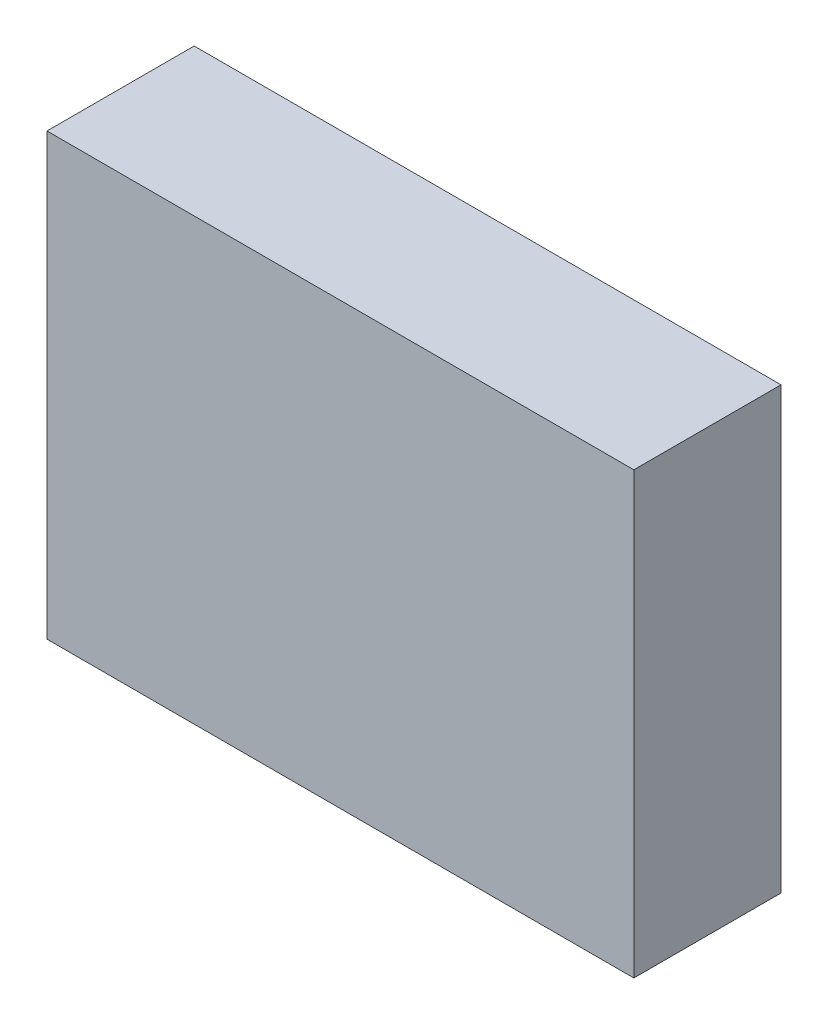
ISO-10303-21;
HEADER;
FILE_DESCRIPTION(('STEP AP214'),'2;1');
FILE_NAME('part.step','',(''),(''),'','','');
FILE_SCHEMA(('AUTOMOTIVE_DESIGN { 1 0 10303 214 1 1 1 1 }'));
ENDSEC;
DATA;
#1=APPLICATION_CONTEXT('core data for automotive mechanical design processes');
#2=APPLICATION_PROTOCOL_DEFINITION('international standard','automotive_design',2000,#1);
#3=PRODUCT_CONTEXT('',#1,'mechanical');
#4=PRODUCT('Part','Part','',(#3));
#5=PRODUCT_RELATED_PRODUCT_CATEGORY('part','',(#4));
#6=PRODUCT_DEFINITION_FORMATION('','',#4);
#7=PRODUCT_DEFINITION_CONTEXT('part definition',#1,'design');
#8=PRODUCT_DEFINITION('design','',#6,#7);
#9=PRODUCT_DEFINITION_SHAPE('','',#8);
#10=(LENGTH_UNIT() NAMED_UNIT(*) SI_UNIT(.MILLI.,.METRE.));
#11=(NAMED_UNIT(*) PLANE_ANGLE_UNIT() SI_UNIT($,.RADIAN.));
#12=(NAMED_UNIT(*) SI_UNIT($,.STERADIAN.) SOLID_ANGLE_UNIT());
#13=UNCERTAINTY_MEASURE_WITH_UNIT(LENGTH_MEASURE(1.E-05),#10,'distance_accuracy_value','');
#14=(GEOMETRIC_REPRESENTATION_CONTEXT(3) GLOBAL_UNCERTAINTY_ASSIGNED_CONTEXT((#13)) GLOBAL_UNIT_ASSIGNED_CONTEXT((#10,
#11,#12)) REPRESENTATION_CONTEXT('',''));
#15=CARTESIAN_POINT('',(0.,0.,0.));
#16=DIRECTION('',(0.,0.,1.));
#17=DIRECTION('',(1.,0.,0.));
#18=AXIS2_PLACEMENT_3D('',#15,#16,#17);
#19=CARTESIAN_POINT('',(59.3051276460055,-52.8416048933411,53.6665382280654));
#20=DIRECTION('',(0.,0.,1.));
#21=DIRECTION('',(1.,0.,0.));
#22=AXIS2_PLACEMENT_3D('',#19,#20,#21);
#23=PLANE('',#22);
#24=DIRECTION('',(-0.469471562785901,0.882947592858921,0.));
#25=VECTOR('',#24,1.);
#26=CARTESIAN_POINT('',(-3.14628098078929,-35.7925910209591,53.6665382280654));
#27=LINE('',#26,#25);
#28=CARTESIAN_POINT('',(-32.7524129730902,19.8884449534964,53.6665382280654));
#29=VERTEX_POINT('',#28);
#30=CARTESIAN_POINT('',(-1.76003319563037,-38.3997439180351,53.6665382280654));
#31=VERTEX_POINT('',#30);
#32=EDGE_CURVE('E441',#29,#31,#27,.F.);
#33=ORIENTED_EDGE('',*,*,#32,.F.);
#34=CARTESIAN_POINT('',(-25.6621679470013,23.6583951066589,53.6665382280654));
#35=DIRECTION('',(0.,0.,1.));
#36=DIRECTION('',(1.,0.,0.));
#37=AXIS2_PLACEMENT_3D('',#34,#35,#36);
#38=CIRCLE('',#37,8.03019916859524);
#39=CARTESIAN_POINT('',(-19.0048311211356,28.148825495194,53.6665382280654));
#40=VERTEX_POINT('',#39);
#41=EDGE_CURVE('E438',#40,#29,#38,.T.);
#42=ORIENTED_EDGE('',*,*,#41,.F.);
#43=DIRECTION('',(0.559192903470745,-0.829037572555043,0.));
#44=VECTOR('',#43,1.);
#45=CARTESIAN_POINT('',(-19.0048311211356,28.148825495194,53.6665382280654));
#46=LINE('',#45,#44);
#47=CARTESIAN_POINT('',(24.76245284847,-36.7388414159568,53.6665382280654));
#48=VERTEX_POINT('',#47);
#49=EDGE_CURVE('E432',#48,#40,#46,.F.);
#50=ORIENTED_EDGE('',*,*,#49,.F.);
#51=DIRECTION('',(0.998044963916957,0.0625000000000001,0.));
#52=VECTOR('',#51,1.);
#53=CARTESIAN_POINT('',(25.849431053587,-36.6707722003644,53.6665382280654));
#54=LINE('',#53,#52);
#55=CARTESIAN_POINT('',(58.1657401979683,-34.6470464219215,53.6665382280654));
#56=VERTEX_POINT('',#55);
#57=EDGE_CURVE('E435',#56,#48,#54,.F.);
#58=ORIENTED_EDGE('',*,*,#57,.F.);
#59=CARTESIAN_POINT('',(59.3051276460055,-52.8416048933411,53.6665382280654));
#60=DIRECTION('',(0.,0.,1.));
#61=DIRECTION('',(1.,0.,0.));
#62=AXIS2_PLACEMENT_3D('',#59,#60,#61);
#63=CIRCLE('',#62,18.2301991685952);
#64=CARTESIAN_POINT('',(58.1657401979683,-71.0361633647607,53.6665382280654));
#65=VERTEX_POINT('',#64);
#66=EDGE_CURVE('E444',#65,#56,#63,.T.);
#67=ORIENTED_EDGE('',*,*,#66,.F.);
#68=DIRECTION('',(-0.998044963916957,0.0625,0.));
#69=VECTOR('',#68,1.);
#70=CARTESIAN_POINT('',(58.1657401979683,-71.0361633647607,53.6665382280654));
#71=LINE('',#70,#69);
#72=CARTESIAN_POINT('',(-23.1155098020317,-65.9461340487842,53.6665382280654));
#73=VERTEX_POINT('',#72);
#74=EDGE_CURVE('E447',#73,#65,#71,.F.);
#75=ORIENTED_EDGE('',*,*,#74,.F.);
#76=CARTESIAN_POINT('',(-22.2948723539945,-52.8416048933411,53.6665382280654));
#77=DIRECTION('',(0.,0.,1.));
#78=DIRECTION('',(1.,0.,0.));
#79=AXIS2_PLACEMENT_3D('',#76,#77,#78);
#80=CIRCLE('',#79,13.1301991685952);
#81=CARTESIAN_POINT('',(-23.1155098020317,-39.737075737898,53.6665382280654));
#82=VERTEX_POINT('',#81);
#83=EDGE_CURVE('E450',#82,#73,#80,.T.);
#84=ORIENTED_EDGE('',*,*,#83,.F.);
#85=DIRECTION('',(0.998044963916957,0.0625000000000001,0.));
#86=VECTOR('',#85,1.);
#87=CARTESIAN_POINT('',(-23.1155098020317,-39.737075737898,53.6665382280654));
#88=LINE('',#87,#86);
#89=EDGE_CURVE('E453',#31,#82,#88,.F.);
#90=ORIENTED_EDGE('',*,*,#89,.F.);
#91=EDGE_LOOP('',(#33,#42,#50,#58,#67,#75,#84,#90));
#92=FACE_BOUND('',#91,.T.);
#93=CARTESIAN_POINT('',(-22.2948723539945,-52.8416048933411,53.6665382280654));
#94=DIRECTION('',(0.,0.,1.));
#95=DIRECTION('',(1.,0.,0.));
#96=AXIS2_PLACEMENT_3D('',#93,#94,#95);
#97=CIRCLE('',#96,5.1);
#98=CARTESIAN_POINT('',(-17.1948723539945,-52.8416048933411,53.6665382280654));
#99=VERTEX_POINT('',#98);
#100=EDGE_CURVE('E361',#99,#99,#97,.T.);
#101=ORIENTED_EDGE('',*,*,#100,.T.);
#102=EDGE_LOOP('',(#101));
#103=FACE_BOUND('',#102,.T.);
#104=CARTESIAN_POINT('',(-27.1285006572868,25.9730850656814,53.6665382280654));
#105=DIRECTION('',(0.,0.,1.));
#106=DIRECTION('',(1.,0.,0.));
#107=AXIS2_PLACEMENT_3D('',#104,#105,#106);
#108=CIRCLE('',#107,4.08000000000002);
#109=CARTESIAN_POINT('',(-23.5951170098463,28.0130850656814,53.6665382280654));
#110=VERTEX_POINT('',#109);
#111=CARTESIAN_POINT('',(-30.6618843047273,23.9330850656813,53.6665382280654));
#112=VERTEX_POINT('',#111);
#113=EDGE_CURVE('E365',#110,#112,#108,.T.);
#114=ORIENTED_EDGE('',*,*,#113,.T.);
#115=DIRECTION('',(0.499999999999998,-0.86602540378444,0.));
#116=VECTOR('',#115,1.);
#117=CARTESIAN_POINT('',(-30.6618843047273,23.9330850656813,53.6665382280654));
#118=LINE('',#117,#116);
#119=CARTESIAN_POINT('',(-10.2618843047272,-11.4007514087238,53.6665382280654));
#120=VERTEX_POINT('',#119);
#121=EDGE_CURVE('E368',#112,#120,#118,.T.);
#122=ORIENTED_EDGE('',*,*,#121,.T.);
#123=CARTESIAN_POINT('',(-6.72850065728666,-9.36075140872365,53.6665382280654));
#124=DIRECTION('',(0.,0.,1.));
#125=DIRECTION('',(1.,0.,0.));
#126=AXIS2_PLACEMENT_3D('',#123,#124,#125);
#127=CIRCLE('',#126,4.08000000000013);
#128=CARTESIAN_POINT('',(-3.19511700984616,-7.32075140872364,53.6665382280654));
#129=VERTEX_POINT('',#128);
#130=EDGE_CURVE('E372',#120,#129,#127,.T.);
#131=ORIENTED_EDGE('',*,*,#130,.T.);
#132=DIRECTION('',(-0.500000000000003,0.866025403784437,0.));
#133=VECTOR('',#132,1.);
#134=CARTESIAN_POINT('',(-23.5951170098463,28.0130850656814,53.6665382280654));
#135=LINE('',#134,#133);
#136=EDGE_CURVE('E376',#129,#110,#135,.T.);
#137=ORIENTED_EDGE('',*,*,#136,.T.);
#138=EDGE_LOOP('',(#114,#122,#131,#137));
#139=FACE_BOUND('',#138,.T.);
#140=DIRECTION('',(-0.866025403784439,-0.5,0.));
#141=VECTOR('',#140,1.);
#142=CARTESIAN_POINT('',(59.3051276460056,-38.7080703035791,53.6665382280654));
#143=LINE('',#142,#141);
#144=CARTESIAN_POINT('',(59.3051276460056,-38.7080703035791,53.6665382280654));
#145=VERTEX_POINT('',#144);
#146=CARTESIAN_POINT('',(47.0651276460055,-45.7748375984601,53.6665382280654));
#147=VERTEX_POINT('',#146);
#148=EDGE_CURVE('E324',#145,#147,#143,.T.);
#149=ORIENTED_EDGE('',*,*,#148,.T.);
#150=DIRECTION('',(0.,-1.,0.));
#151=VECTOR('',#150,1.);
#152=CARTESIAN_POINT('',(47.0651276460055,-45.7748375984601,53.6665382280654));
#153=LINE('',#152,#151);
#154=CARTESIAN_POINT('',(47.0651276460055,-59.9083721882221,53.6665382280654));
#155=VERTEX_POINT('',#154);
#156=EDGE_CURVE('E328',#147,#155,#153,.T.);
#157=ORIENTED_EDGE('',*,*,#156,.T.);
#158=DIRECTION('',(0.866025403784438,-0.5,0.));
#159=VECTOR('',#158,1.);
#160=CARTESIAN_POINT('',(47.0651276460055,-59.9083721882221,53.6665382280654));
#161=LINE('',#160,#159);
#162=CARTESIAN_POINT('',(59.3051276460055,-66.9751394831032,53.6665382280654));
#163=VERTEX_POINT('',#162);
#164=EDGE_CURVE('E331',#155,#163,#161,.T.);
#165=ORIENTED_EDGE('',*,*,#164,.T.);
#166=DIRECTION('',(0.866025403784439,0.5,0.));
#167=VECTOR('',#166,1.);
#168=CARTESIAN_POINT('',(59.3051276460055,-66.9751394831032,53.6665382280654));
#169=LINE('',#168,#167);
#170=CARTESIAN_POINT('',(71.5451276460055,-59.9083721882221,53.6665382280654));
#171=VERTEX_POINT('',#170);
#172=EDGE_CURVE('E334',#163,#171,#169,.T.);
#173=ORIENTED_EDGE('',*,*,#172,.T.);
#174=DIRECTION('',(0.,1.,0.));
#175=VECTOR('',#174,1.);
#176=CARTESIAN_POINT('',(71.5451276460055,-59.9083721882221,53.6665382280654));
#177=LINE('',#176,#175);
#178=CARTESIAN_POINT('',(71.5451276460055,-45.7748375984601,53.6665382280654));
#179=VERTEX_POINT('',#178);
#180=EDGE_CURVE('E304',#171,#179,#177,.T.);
#181=ORIENTED_EDGE('',*,*,#180,.T.);
#182=DIRECTION('',(-0.866025403784438,0.5,0.));
#183=VECTOR('',#182,1.);
#184=CARTESIAN_POINT('',(71.5451276460055,-45.7748375984601,53.6665382280654));
#185=LINE('',#184,#183);
#186=EDGE_CURVE('E320',#179,#145,#185,.T.);
#187=ORIENTED_EDGE('',*,*,#186,.T.);
#188=EDGE_LOOP('',(#149,#157,#165,#173,#181,#187));
#189=FACE_BOUND('',#188,.T.);
#190=ADVANCED_FACE('F38',(#92,#103,#139,#189),#23,.F.);
#191=CARTESIAN_POINT('',(-23.2511223539945,-37.5715169454117,49.8415382280655));
#192=DIRECTION('',(-0.0623477531412391,0.99561377654642,0.0697564737441255));
#193=DIRECTION('',(0.,-0.0698924504621114,0.997554532528624));
#194=AXIS2_PLACEMENT_3D('',#191,#192,#193);
#195=PLANE('',#194);
#196=DIRECTION('',(-0.00435977960900785,0.0696200973209298,-0.997564050259824));
#197=VECTOR('',#196,1.);
#198=CARTESIAN_POINT('',(-23.2511223539945,-37.5715169454117,49.8415382280655));
#199=LINE('',#198,#197);
#200=CARTESIAN_POINT('',(-23.2426992184398,-37.7060236337433,51.7688414345035));
#201=VERTEX_POINT('',#200);
#202=CARTESIAN_POINT('',(-23.2511223539945,-37.5715169454117,49.8415382280655));
#203=VERTEX_POINT('',#202);
#204=EDGE_CURVE('E232',#201,#203,#199,.T.);
#205=ORIENTED_EDGE('',*,*,#204,.T.);
#206=DIRECTION('',(-0.998044963916957,-0.0625000000000001,0.));
#207=VECTOR('',#206,1.);
#208=CARTESIAN_POINT('',(-23.2511223539945,-37.5715169454117,49.8415382280655));
#209=LINE('',#208,#207);
#210=CARTESIAN_POINT('',(-2.87671476836382,-36.2956220507525,49.8415382280655));
#211=VERTEX_POINT('',#210);
#212=EDGE_CURVE('E216',#211,#203,#209,.T.);
#213=ORIENTED_EDGE('',*,*,#212,.F.);
#214=CARTESIAN_POINT('',(-2.80316640536326,-36.4339464035306,51.8815382280655));
#215=DIRECTION('',(-0.0623477531412391,0.99561377654642,0.0697564737441255));
#216=DIRECTION('',(0.987129361998023,0.0512013597358323,0.151505918836785));
#217=AXIS2_PLACEMENT_3D('',#214,#215,#216);
#218=ELLIPSE('',#217,2.24584201047838,2.04);
#219=CARTESIAN_POINT('',(-5.03980616289259,-36.5661142538024,51.7688414345035));
#220=VERTEX_POINT('',#219);
#221=EDGE_CURVE('E225',#220,#211,#218,.F.);
#222=ORIENTED_EDGE('',*,*,#221,.F.);
#223=DIRECTION('',(-0.998044963916957,-0.0625000000000001,0.));
#224=VECTOR('',#223,1.);
#225=CARTESIAN_POINT('',(-4.83423310295901,-36.5532407694301,51.7688414345035));
#226=LINE('',#225,#224);
#227=EDGE_CURVE('E457',#201,#220,#226,.F.);
#228=ORIENTED_EDGE('',*,*,#227,.F.);
#229=EDGE_LOOP('',(#205,#213,#222,#228));
#230=FACE_BOUND('',#229,.T.);
#231=ADVANCED_FACE('F228',(#230),#195,.F.);
#232=CARTESIAN_POINT('',(58.0301276460056,-32.4814876294352,49.8415382280655));
#233=VERTEX_POINT('',#232);
#234=CARTESIAN_POINT('',(23.3533212142919,-34.6530334819149,49.8415382280655));
#235=VERTEX_POINT('',#234);
#236=EDGE_CURVE('E235',#233,#235,#209,.T.);
#237=ORIENTED_EDGE('',*,*,#236,.F.);
#238=DIRECTION('',(-0.00435977960900785,0.0696200973209298,-0.997564050259824));
#239=VECTOR('',#238,1.);
#240=CARTESIAN_POINT('',(58.0301276460055,-32.4814876294352,49.8415382280655));
#241=LINE('',#240,#239);
#242=CARTESIAN_POINT('',(58.0385507815602,-32.6159943177668,51.7688414345035));
#243=VERTEX_POINT('',#242);
#244=EDGE_CURVE('E394',#243,#233,#241,.T.);
#245=ORIENTED_EDGE('',*,*,#244,.F.);
#246=DIRECTION('',(-0.998044963916957,-0.0625000000000001,0.));
#247=VECTOR('',#246,1.);
#248=CARTESIAN_POINT('',(58.0385507815602,-32.6159943177668,51.7688414345035));
#249=LINE('',#248,#247);
#250=CARTESIAN_POINT('',(25.7980654038046,-34.6349718277595,51.7688414345035));
#251=VERTEX_POINT('',#250);
#252=EDGE_CURVE('E475',#251,#243,#249,.F.);
#253=ORIENTED_EDGE('',*,*,#252,.F.);
#254=CARTESIAN_POINT('',(23.4458216450798,-34.7901710101715,51.8815382280655));
#255=DIRECTION('',(-0.0623477531412391,0.99561377654642,0.0697564737441255));
#256=DIRECTION('',(-0.991588061139328,-0.053849115379293,-0.117700423868464));
#257=AXIS2_PLACEMENT_3D('',#254,#255,#256);
#258=ELLIPSE('',#257,2.37136052208357,2.04);
#259=EDGE_CURVE('E244',#235,#251,#258,.F.);
#260=ORIENTED_EDGE('',*,*,#259,.F.);
#261=EDGE_LOOP('',(#237,#245,#253,#260));
#262=FACE_BOUND('',#261,.T.);
#263=ADVANCED_FACE('F567',(#262),#195,.F.);
#264=CARTESIAN_POINT('',(59.3051276460055,-52.8416048933411,49.8415382280655));
#265=DIRECTION('',(0.,0.,-1.));
#266=DIRECTION('',(1.,0.,0.));
#267=AXIS2_PLACEMENT_3D('',#264,#265,#266);
#268=CONICAL_SURFACE('',#267,20.4,0.0698131700797733);
#269=ORIENTED_EDGE('',*,*,#244,.T.);
#270=CARTESIAN_POINT('',(59.3051276460055,-52.8416048933411,49.8415382280655));
#271=DIRECTION('',(0.,0.,1.));
#272=DIRECTION('',(1.,0.,0.));
#273=AXIS2_PLACEMENT_3D('',#270,#271,#272);
#274=CIRCLE('',#273,20.4);
#275=CARTESIAN_POINT('',(58.0301276460055,-73.201722157247,49.8415382280655));
#276=VERTEX_POINT('',#275);
#277=EDGE_CURVE('E236',#276,#233,#274,.T.);
#278=ORIENTED_EDGE('',*,*,#277,.F.);
#279=DIRECTION('',(-0.00435977960900784,-0.0696200973209298,-0.997564050259824));
#280=VECTOR('',#279,1.);
#281=CARTESIAN_POINT('',(58.0301276460055,-73.2017221572471,49.8415382280655));
#282=LINE('',#281,#280);
#283=CARTESIAN_POINT('',(58.0385507815602,-73.0672154689154,51.7688414345035));
#284=VERTEX_POINT('',#283);
#285=EDGE_CURVE('E384',#284,#276,#282,.T.);
#286=ORIENTED_EDGE('',*,*,#285,.F.);
#287=CARTESIAN_POINT('',(59.3051276460055,-52.8416048933411,51.7688414345035));
#288=DIRECTION('',(0.,0.,-1.));
#289=DIRECTION('',(-1.,0.,0.));
#290=AXIS2_PLACEMENT_3D('',#287,#288,#289);
#291=CIRCLE('',#290,20.2652298311253);
#292=EDGE_CURVE('E466',#243,#284,#291,.T.);
#293=ORIENTED_EDGE('',*,*,#292,.F.);
#294=EDGE_LOOP('',(#269,#278,#286,#293));
#295=FACE_BOUND('',#294,.T.);
#296=ADVANCED_FACE('F562',(#295),#268,.F.);
#297=CARTESIAN_POINT('',(-22.2948723539945,-52.8416048933411,49.8415382280655));
#298=DIRECTION('',(0.,0.,-1.));
#299=DIRECTION('',(1.,0.,0.));
#300=AXIS2_PLACEMENT_3D('',#297,#298,#299);
#301=CONICAL_SURFACE('',#300,15.3,0.0698131700797733);
#302=DIRECTION('',(-0.00435977960900784,-0.0696200973209298,-0.997564050259824));
#303=VECTOR('',#302,1.);
#304=CARTESIAN_POINT('',(-23.2511223539945,-68.1116928412706,49.8415382280655));
#305=LINE('',#304,#303);
#306=CARTESIAN_POINT('',(-23.2426992184398,-67.9771861529389,51.7688414345035));
#307=VERTEX_POINT('',#306);
#308=CARTESIAN_POINT('',(-23.2511223539945,-68.1116928412706,49.8415382280655));
#309=VERTEX_POINT('',#308);
#310=EDGE_CURVE('E401',#307,#309,#305,.T.);
#311=ORIENTED_EDGE('',*,*,#310,.T.);
#312=CARTESIAN_POINT('',(-22.2948723539945,-52.8416048933411,49.8415382280655));
#313=DIRECTION('',(0.,0.,1.));
#314=DIRECTION('',(1.,0.,0.));
#315=AXIS2_PLACEMENT_3D('',#312,#313,#314);
#316=CIRCLE('',#315,15.3);
#317=EDGE_CURVE('E410',#203,#309,#316,.T.);
#318=ORIENTED_EDGE('',*,*,#317,.F.);
#319=ORIENTED_EDGE('',*,*,#204,.F.);
#320=CARTESIAN_POINT('',(-22.2948723539945,-52.8416048933411,51.7688414345035));
#321=DIRECTION('',(0.,0.,-1.));
#322=DIRECTION('',(-1.,0.,0.));
#323=AXIS2_PLACEMENT_3D('',#320,#321,#322);
#324=CIRCLE('',#323,15.1652298311253);
#325=EDGE_CURVE('E460',#307,#201,#324,.T.);
#326=ORIENTED_EDGE('',*,*,#325,.F.);
#327=EDGE_LOOP('',(#311,#318,#319,#326));
#328=FACE_BOUND('',#327,.T.);
#329=ADVANCED_FACE('F554',(#328),#301,.F.);
#330=CARTESIAN_POINT('',(-23.2511223539945,-68.1116928412706,49.8415382280655));
#331=DIRECTION('',(-0.062347753141239,-0.99561377654642,0.0697564737441255));
#332=DIRECTION('',(0.,-0.0698924504621114,-0.997554532528624));
#333=AXIS2_PLACEMENT_3D('',#330,#331,#332);
#334=PLANE('',#333);
#335=ORIENTED_EDGE('',*,*,#285,.T.);
#336=DIRECTION('',(0.998044963916957,-0.0625,0.));
#337=VECTOR('',#336,1.);
#338=CARTESIAN_POINT('',(-23.2511223539945,-68.1116928412706,49.8415382280655));
#339=LINE('',#338,#337);
#340=EDGE_CURVE('E413',#309,#276,#339,.T.);
#341=ORIENTED_EDGE('',*,*,#340,.F.);
#342=ORIENTED_EDGE('',*,*,#310,.F.);
#343=DIRECTION('',(0.998044963916957,-0.0625,0.));
#344=VECTOR('',#343,1.);
#345=CARTESIAN_POINT('',(-23.2426992184398,-67.9771861529389,51.7688414345035));
#346=LINE('',#345,#344);
#347=EDGE_CURVE('E463',#284,#307,#346,.F.);
#348=ORIENTED_EDGE('',*,*,#347,.F.);
#349=EDGE_LOOP('',(#335,#341,#342,#348));
#350=FACE_BOUND('',#349,.T.);
#351=ADVANCED_FACE('F559',(#350),#334,.F.);
#352=CARTESIAN_POINT('',(-27.1285006572868,25.9730850656814,46.0165382280654));
#353=DIRECTION('',(0.,0.,1.));
#354=DIRECTION('',(1.,0.,0.));
#355=AXIS2_PLACEMENT_3D('',#352,#353,#354);
#356=CYLINDRICAL_SURFACE('',#355,4.08000000000002);
#357=DIRECTION('',(0.,0.,1.));
#358=VECTOR('',#357,1.);
#359=CARTESIAN_POINT('',(-23.5951170098463,28.0130850656814,46.0165382280654));
#360=LINE('',#359,#358);
#361=CARTESIAN_POINT('',(-23.5951170098463,28.0130850656814,49.8415382280655));
#362=VERTEX_POINT('',#361);
#363=EDGE_CURVE('E381',#362,#110,#360,.T.);
#364=ORIENTED_EDGE('',*,*,#363,.F.);
#365=CARTESIAN_POINT('',(-27.1285006572868,25.9730850656814,49.8415382280655));
#366=DIRECTION('',(0.,0.,1.));
#367=DIRECTION('',(1.,0.,0.));
#368=AXIS2_PLACEMENT_3D('',#365,#366,#367);
#369=CIRCLE('',#368,4.08000000000002);
#370=CARTESIAN_POINT('',(-30.6618843047273,23.9330850656813,49.8415382280655));
#371=VERTEX_POINT('',#370);
#372=EDGE_CURVE('E428',#362,#371,#369,.T.);
#373=ORIENTED_EDGE('',*,*,#372,.T.);
#374=DIRECTION('',(0.,0.,1.));
#375=VECTOR('',#374,1.);
#376=CARTESIAN_POINT('',(-30.6618843047273,23.9330850656813,46.0165382280654));
#377=LINE('',#376,#375);
#378=EDGE_CURVE('E380',#371,#112,#377,.T.);
#379=ORIENTED_EDGE('',*,*,#378,.T.);
#380=ORIENTED_EDGE('',*,*,#113,.F.);
#381=EDGE_LOOP('',(#364,#373,#379,#380));
#382=FACE_BOUND('',#381,.T.);
#383=ADVANCED_FACE('F588',(#382),#356,.T.);
#384=CARTESIAN_POINT('',(-23.5951170098463,28.0130850656814,46.0165382280654));
#385=DIRECTION('',(0.866025403784437,0.500000000000003,0.));
#386=DIRECTION('',(-0.500000000000003,0.866025403784437,0.));
#387=AXIS2_PLACEMENT_3D('',#384,#385,#386);
#388=PLANE('',#387);
#389=DIRECTION('',(0.,0.,1.));
#390=VECTOR('',#389,1.);
#391=CARTESIAN_POINT('',(-3.19511700984616,-7.32075140872364,46.0165382280654));
#392=LINE('',#391,#390);
#393=CARTESIAN_POINT('',(-3.19511700984605,-7.32075140872357,49.8415382280655));
#394=VERTEX_POINT('',#393);
#395=EDGE_CURVE('E385',#394,#129,#392,.T.);
#396=ORIENTED_EDGE('',*,*,#395,.F.);
#397=DIRECTION('',(-0.500000000000003,0.866025403784437,0.));
#398=VECTOR('',#397,1.);
#399=CARTESIAN_POINT('',(-22.2262436790758,25.6421269076609,49.8415382280655));
#400=LINE('',#399,#398);
#401=EDGE_CURVE('E424',#394,#362,#400,.T.);
#402=ORIENTED_EDGE('',*,*,#401,.T.);
#403=ORIENTED_EDGE('',*,*,#363,.T.);
#404=ORIENTED_EDGE('',*,*,#136,.F.);
#405=EDGE_LOOP('',(#396,#402,#403,#404));
#406=FACE_BOUND('',#405,.T.);
#407=ADVANCED_FACE('F740',(#406),#388,.T.);
#408=CARTESIAN_POINT('',(-6.72850065728666,-9.36075140872365,46.0165382280654));
#409=DIRECTION('',(0.,0.,1.));
#410=DIRECTION('',(1.,0.,0.));
#411=AXIS2_PLACEMENT_3D('',#408,#409,#410);
#412=CYLINDRICAL_SURFACE('',#411,4.08000000000013);
#413=DIRECTION('',(0.,0.,1.));
#414=VECTOR('',#413,1.);
#415=CARTESIAN_POINT('',(-10.2618843047272,-11.4007514087238,46.0165382280654));
#416=LINE('',#415,#414);
#417=CARTESIAN_POINT('',(-10.2618843047274,-11.4007514087238,49.8415382280655));
#418=VERTEX_POINT('',#417);
#419=EDGE_CURVE('E388',#418,#120,#416,.T.);
#420=ORIENTED_EDGE('',*,*,#419,.F.);
#421=CARTESIAN_POINT('',(-6.72850065728666,-9.36075140872365,49.8415382280655));
#422=DIRECTION('',(0.,0.,1.));
#423=DIRECTION('',(1.,0.,0.));
#424=AXIS2_PLACEMENT_3D('',#421,#422,#423);
#425=CIRCLE('',#424,4.08000000000013);
#426=EDGE_CURVE('E420',#418,#394,#425,.T.);
#427=ORIENTED_EDGE('',*,*,#426,.T.);
#428=ORIENTED_EDGE('',*,*,#395,.T.);
#429=ORIENTED_EDGE('',*,*,#130,.F.);
#430=EDGE_LOOP('',(#420,#427,#428,#429));
#431=FACE_BOUND('',#430,.T.);
#432=ADVANCED_FACE('F748',(#431),#412,.T.);
#433=CARTESIAN_POINT('',(-30.6618843047273,23.9330850656813,46.0165382280654));
#434=DIRECTION('',(-0.86602540378444,-0.499999999999998,0.));
#435=DIRECTION('',(0.499999999999998,-0.86602540378444,0.));
#436=AXIS2_PLACEMENT_3D('',#433,#434,#435);
#437=PLANE('',#436);
#438=ORIENTED_EDGE('',*,*,#378,.F.);
#439=DIRECTION('',(0.499999999999998,-0.86602540378444,0.));
#440=VECTOR('',#439,1.);
#441=CARTESIAN_POINT('',(-29.2930109739568,21.5621269076609,49.8415382280655));
#442=LINE('',#441,#440);
#443=EDGE_CURVE('E416',#371,#418,#442,.T.);
#444=ORIENTED_EDGE('',*,*,#443,.T.);
#445=ORIENTED_EDGE('',*,*,#419,.T.);
#446=ORIENTED_EDGE('',*,*,#121,.F.);
#447=EDGE_LOOP('',(#438,#444,#445,#446));
#448=FACE_BOUND('',#447,.T.);
#449=ADVANCED_FACE('F757',(#448),#437,.T.);
#450=CARTESIAN_POINT('',(-22.2948723539945,-52.8416048933411,46.0165382280654));
#451=DIRECTION('',(0.,0.,1.));
#452=DIRECTION('',(1.,0.,0.));
#453=AXIS2_PLACEMENT_3D('',#450,#451,#452);
#454=CYLINDRICAL_SURFACE('',#453,5.1);
#455=CARTESIAN_POINT('',(-22.2948723539945,-52.8416048933411,49.8415382280655));
#456=DIRECTION('',(0.,0.,1.));
#457=DIRECTION('',(1.,0.,0.));
#458=AXIS2_PLACEMENT_3D('',#455,#456,#457);
#459=CIRCLE('',#458,5.1);
#460=CARTESIAN_POINT('',(-17.1948723539945,-52.8416048933411,49.8415382280655));
#461=VERTEX_POINT('',#460);
#462=EDGE_CURVE('E11',#461,#461,#459,.F.);
#463=ORIENTED_EDGE('',*,*,#462,.F.);
#464=EDGE_LOOP('',(#463));
#465=FACE_BOUND('',#464,.T.);
#466=ORIENTED_EDGE('',*,*,#100,.F.);
#467=EDGE_LOOP('',(#466));
#468=FACE_BOUND('',#467,.T.);
#469=ADVANCED_FACE('F766',(#465,#468),#454,.T.);
#470=CARTESIAN_POINT('',(71.5451276460055,-45.7748375984601,60.8065382280655));
#471=DIRECTION('',(-0.5,-0.866025403784438,0.));
#472=DIRECTION('',(0.866025403784439,-0.5,0.));
#473=AXIS2_PLACEMENT_3D('',#470,#471,#472);
#474=PLANE('',#473);
#475=ORIENTED_EDGE('',*,*,#186,.F.);
#476=DIRECTION('',(0.,0.,-1.));
#477=VECTOR('',#476,1.);
#478=CARTESIAN_POINT('',(71.5451276460055,-45.7748375984601,60.8065382280655));
#479=LINE('',#478,#477);
#480=CARTESIAN_POINT('',(71.5451276460055,-45.7748375984601,60.8065382280655));
#481=VERTEX_POINT('',#480);
#482=EDGE_CURVE('E319',#481,#179,#479,.T.);
#483=ORIENTED_EDGE('',*,*,#482,.F.);
#484=DIRECTION('',(-0.866025403784438,0.5,0.));
#485=VECTOR('',#484,1.);
#486=CARTESIAN_POINT('',(71.5451276460055,-45.7748375984601,60.8065382280655));
#487=LINE('',#486,#485);
#488=CARTESIAN_POINT('',(59.3051276460056,-38.7080703035791,60.8065382280655));
#489=VERTEX_POINT('',#488);
#490=EDGE_CURVE('E299',#481,#489,#487,.T.);
#491=ORIENTED_EDGE('',*,*,#490,.T.);
#492=DIRECTION('',(0.,0.,-1.));
#493=VECTOR('',#492,1.);
#494=CARTESIAN_POINT('',(59.3051276460056,-38.7080703035791,60.8065382280655));
#495=LINE('',#494,#493);
#496=EDGE_CURVE('E358',#489,#145,#495,.T.);
#497=ORIENTED_EDGE('',*,*,#496,.T.);
#498=EDGE_LOOP('',(#475,#483,#491,#497));
#499=FACE_BOUND('',#498,.T.);
#500=ADVANCED_FACE('F773',(#499),#474,.T.);
#501=CARTESIAN_POINT('',(59.3051276460056,-38.7080703035791,60.8065382280655));
#502=DIRECTION('',(0.5,-0.866025403784439,0.));
#503=DIRECTION('',(0.866025403784439,0.5,0.));
#504=AXIS2_PLACEMENT_3D('',#501,#502,#503);
#505=PLANE('',#504);
#506=ORIENTED_EDGE('',*,*,#148,.F.);
#507=ORIENTED_EDGE('',*,*,#496,.F.);
#508=DIRECTION('',(-0.866025403784439,-0.5,0.));
#509=VECTOR('',#508,1.);
#510=CARTESIAN_POINT('',(59.3051276460056,-38.7080703035791,60.8065382280655));
#511=LINE('',#510,#509);
#512=CARTESIAN_POINT('',(47.0651276460055,-45.7748375984601,60.8065382280655));
#513=VERTEX_POINT('',#512);
#514=EDGE_CURVE('E303',#489,#513,#511,.T.);
#515=ORIENTED_EDGE('',*,*,#514,.T.);
#516=DIRECTION('',(0.,0.,-1.));
#517=VECTOR('',#516,1.);
#518=CARTESIAN_POINT('',(47.0651276460055,-45.7748375984601,60.8065382280655));
#519=LINE('',#518,#517);
#520=EDGE_CURVE('E354',#513,#147,#519,.T.);
#521=ORIENTED_EDGE('',*,*,#520,.T.);
#522=EDGE_LOOP('',(#506,#507,#515,#521));
#523=FACE_BOUND('',#522,.T.);
#524=ADVANCED_FACE('F781',(#523),#505,.T.);
#525=CARTESIAN_POINT('',(47.0651276460055,-45.7748375984601,60.8065382280655));
#526=DIRECTION('',(1.,0.,0.));
#527=DIRECTION('',(0.,0.,-1.));
#528=AXIS2_PLACEMENT_3D('',#525,#526,#527);
#529=PLANE('',#528);
#530=ORIENTED_EDGE('',*,*,#156,.F.);
#531=ORIENTED_EDGE('',*,*,#520,.F.);
#532=DIRECTION('',(0.,-1.,0.));
#533=VECTOR('',#532,1.);
#534=CARTESIAN_POINT('',(47.0651276460055,-45.7748375984601,60.8065382280655));
#535=LINE('',#534,#533);
#536=CARTESIAN_POINT('',(47.0651276460055,-59.9083721882221,60.8065382280655));
#537=VERTEX_POINT('',#536);
#538=EDGE_CURVE('E307',#513,#537,#535,.T.);
#539=ORIENTED_EDGE('',*,*,#538,.T.);
#540=DIRECTION('',(0.,0.,-1.));
#541=VECTOR('',#540,1.);
#542=CARTESIAN_POINT('',(47.0651276460055,-59.9083721882221,60.8065382280655));
#543=LINE('',#542,#541);
#544=EDGE_CURVE('E350',#537,#155,#543,.T.);
#545=ORIENTED_EDGE('',*,*,#544,.T.);
#546=EDGE_LOOP('',(#530,#531,#539,#545));
#547=FACE_BOUND('',#546,.T.);
#548=ADVANCED_FACE('F791',(#547),#529,.T.);
#549=CARTESIAN_POINT('',(47.0651276460055,-59.9083721882221,60.8065382280655));
#550=DIRECTION('',(0.5,0.866025403784438,0.));
#551=DIRECTION('',(-0.866025403784438,0.5,0.));
#552=AXIS2_PLACEMENT_3D('',#549,#550,#551);
#553=PLANE('',#552);
#554=ORIENTED_EDGE('',*,*,#164,.F.);
#555=ORIENTED_EDGE('',*,*,#544,.F.);
#556=DIRECTION('',(0.866025403784438,-0.5,0.));
#557=VECTOR('',#556,1.);
#558=CARTESIAN_POINT('',(47.0651276460055,-59.9083721882221,60.8065382280655));
#559=LINE('',#558,#557);
#560=CARTESIAN_POINT('',(59.3051276460055,-66.9751394831032,60.8065382280655));
#561=VERTEX_POINT('',#560);
#562=EDGE_CURVE('E310',#537,#561,#559,.T.);
#563=ORIENTED_EDGE('',*,*,#562,.T.);
#564=DIRECTION('',(0.,0.,-1.));
#565=VECTOR('',#564,1.);
#566=CARTESIAN_POINT('',(59.3051276460055,-66.9751394831032,60.8065382280655));
#567=LINE('',#566,#565);
#568=EDGE_CURVE('E346',#561,#163,#567,.T.);
#569=ORIENTED_EDGE('',*,*,#568,.T.);
#570=EDGE_LOOP('',(#554,#555,#563,#569));
#571=FACE_BOUND('',#570,.T.);
#572=ADVANCED_FACE('F801',(#571),#553,.T.);
#573=CARTESIAN_POINT('',(59.3051276460055,-66.9751394831032,60.8065382280655));
#574=DIRECTION('',(-0.5,0.866025403784439,0.));
#575=DIRECTION('',(-0.866025403784439,-0.5,0.));
#576=AXIS2_PLACEMENT_3D('',#573,#574,#575);
#577=PLANE('',#576);
#578=ORIENTED_EDGE('',*,*,#172,.F.);
#579=ORIENTED_EDGE('',*,*,#568,.F.);
#580=DIRECTION('',(0.866025403784439,0.5,0.));
#581=VECTOR('',#580,1.);
#582=CARTESIAN_POINT('',(59.3051276460055,-66.9751394831032,60.8065382280655));
#583=LINE('',#582,#581);
#584=CARTESIAN_POINT('',(71.5451276460055,-59.9083721882221,60.8065382280655));
#585=VERTEX_POINT('',#584);
#586=EDGE_CURVE('E313',#561,#585,#583,.T.);
#587=ORIENTED_EDGE('',*,*,#586,.T.);
#588=DIRECTION('',(0.,0.,-1.));
#589=VECTOR('',#588,1.);
#590=CARTESIAN_POINT('',(71.5451276460055,-59.9083721882221,60.8065382280655));
#591=LINE('',#590,#589);
#592=EDGE_CURVE('E343',#585,#171,#591,.T.);
#593=ORIENTED_EDGE('',*,*,#592,.T.);
#594=EDGE_LOOP('',(#578,#579,#587,#593));
#595=FACE_BOUND('',#594,.T.);
#596=ADVANCED_FACE('F811',(#595),#577,.T.);
#597=CARTESIAN_POINT('',(71.5451276460055,-59.9083721882221,60.8065382280655));
#598=DIRECTION('',(-1.,0.,0.));
#599=DIRECTION('',(0.,0.,1.));
#600=AXIS2_PLACEMENT_3D('',#597,#598,#599);
#601=PLANE('',#600);
#602=ORIENTED_EDGE('',*,*,#180,.F.);
#603=ORIENTED_EDGE('',*,*,#592,.F.);
#604=DIRECTION('',(0.,1.,0.));
#605=VECTOR('',#604,1.);
#606=CARTESIAN_POINT('',(71.5451276460055,-59.9083721882221,60.8065382280655));
#607=LINE('',#606,#605);
#608=EDGE_CURVE('E316',#585,#481,#607,.T.);
#609=ORIENTED_EDGE('',*,*,#608,.T.);
#610=ORIENTED_EDGE('',*,*,#482,.T.);
#611=EDGE_LOOP('',(#602,#603,#609,#610));
#612=FACE_BOUND('',#611,.T.);
#613=ADVANCED_FACE('F821',(#612),#601,.T.);
#614=CARTESIAN_POINT('',(11.2065939216654,-52.8416048933411,60.8065382280655));
#615=DIRECTION('',(0.,0.,1.));
#616=DIRECTION('',(1.,0.,0.));
#617=AXIS2_PLACEMENT_3D('',#614,#615,#616);
#618=PLANE('',#617);
#619=ORIENTED_EDGE('',*,*,#490,.F.);
#620=ORIENTED_EDGE('',*,*,#608,.F.);
#621=ORIENTED_EDGE('',*,*,#586,.F.);
#622=ORIENTED_EDGE('',*,*,#562,.F.);
#623=ORIENTED_EDGE('',*,*,#538,.F.);
#624=ORIENTED_EDGE('',*,*,#514,.F.);
#625=EDGE_LOOP('',(#619,#620,#621,#622,#623,#624));
#626=FACE_BOUND('',#625,.T.);
#627=ADVANCED_FACE('F831',(#626),#618,.F.);
#628=CARTESIAN_POINT('',(58.1657401979683,-34.6470464219215,51.6265382280655));
#629=DIRECTION('',(-0.998044963916957,-0.0625000000000001,0.));
#630=DIRECTION('',(0.0625000000000001,-0.998044963916957,0.));
#631=AXIS2_PLACEMENT_3D('',#628,#629,#630);
#632=CYLINDRICAL_SURFACE('',#631,2.04);
#633=CARTESIAN_POINT('',(58.1657401979683,-34.6470464219215,51.6265382280655));
#634=DIRECTION('',(0.998044963916957,0.0624999999999989,0.));
#635=DIRECTION('',(-0.0624999999999989,0.998044963916957,0.));
#636=AXIS2_PLACEMENT_3D('',#633,#634,#635);
#637=CIRCLE('',#636,2.04);
#638=EDGE_CURVE('E504',#243,#56,#637,.T.);
#639=ORIENTED_EDGE('',*,*,#638,.T.);
#640=ORIENTED_EDGE('',*,*,#57,.T.);
#641=CARTESIAN_POINT('',(24.76245284847,-36.7388414159569,51.6265382280655));
#642=DIRECTION('',(-0.897194100920132,0.441636440156511,0.));
#643=DIRECTION('',(-0.441636440156511,-0.897194100920132,0.));
#644=AXIS2_PLACEMENT_3D('',#641,#642,#643);
#645=ELLIPSE('',#644,2.35066973929602,2.04);
#646=EDGE_CURVE('E325',#48,#251,#645,.T.);
#647=ORIENTED_EDGE('',*,*,#646,.T.);
#648=ORIENTED_EDGE('',*,*,#252,.T.);
#649=EDGE_LOOP('',(#639,#640,#647,#648));
#650=FACE_BOUND('',#649,.T.);
#651=ADVANCED_FACE('F569',(#650),#632,.F.);
#652=CARTESIAN_POINT('',(43.0289445356177,-63.8200290229846,51.6265382280655));
#653=DIRECTION('',(-0.559192903470745,0.829037572555043,0.));
#654=DIRECTION('',(-0.829037572555043,-0.559192903470745,0.));
#655=AXIS2_PLACEMENT_3D('',#652,#653,#654);
#656=CYLINDRICAL_SURFACE('',#655,2.04);
#657=ORIENTED_EDGE('',*,*,#646,.F.);
#658=ORIENTED_EDGE('',*,*,#49,.T.);
#659=CARTESIAN_POINT('',(-19.0048311211356,28.148825495194,51.6265382280655));
#660=DIRECTION('',(-0.559192903470747,0.829037572555042,0.));
#661=DIRECTION('',(-0.829037572555042,-0.559192903470747,0.));
#662=AXIS2_PLACEMENT_3D('',#659,#660,#661);
#663=CIRCLE('',#662,2.04);
#664=CARTESIAN_POINT('',(-17.3177142405966,29.2868002000262,51.7688414345035));
#665=VERTEX_POINT('',#664);
#666=EDGE_CURVE('E500',#40,#665,#663,.T.);
#667=ORIENTED_EDGE('',*,*,#666,.T.);
#668=DIRECTION('',(-0.559192903470745,0.829037572555043,0.));
#669=VECTOR('',#668,1.);
#670=CARTESIAN_POINT('',(25.8405485721431,-34.6979557149569,51.7688414345035));
#671=LINE('',#670,#669);
#672=EDGE_CURVE('E478',#665,#251,#671,.F.);
#673=ORIENTED_EDGE('',*,*,#672,.T.);
#674=EDGE_LOOP('',(#657,#658,#667,#673));
#675=FACE_BOUND('',#674,.T.);
#676=ADVANCED_FACE('F524',(#675),#656,.F.);
#677=CARTESIAN_POINT('',(59.3051276460055,-52.8416048933411,51.6265382280655));
#678=DIRECTION('',(0.,0.,1.));
#679=DIRECTION('',(1.,0.,0.));
#680=AXIS2_PLACEMENT_3D('',#677,#678,#679);
#681=TOROIDAL_SURFACE('',#680,18.2301991685952,2.04);
#682=ORIENTED_EDGE('',*,*,#638,.F.);
#683=ORIENTED_EDGE('',*,*,#292,.T.);
#684=CARTESIAN_POINT('',(58.1657401979683,-71.0361633647607,51.6265382280655));
#685=DIRECTION('',(-0.998044963916957,0.0624999999999986,0.));
#686=DIRECTION('',(-0.0624999999999986,-0.998044963916957,0.));
#687=AXIS2_PLACEMENT_3D('',#684,#685,#686);
#688=CIRCLE('',#687,2.04);
#689=EDGE_CURVE('E496',#284,#65,#688,.T.);
#690=ORIENTED_EDGE('',*,*,#689,.T.);
#691=ORIENTED_EDGE('',*,*,#66,.T.);
#692=EDGE_LOOP('',(#682,#683,#690,#691));
#693=FACE_BOUND('',#692,.T.);
#694=ADVANCED_FACE('F571',(#693),#681,.F.);
#695=CARTESIAN_POINT('',(-25.6621679470013,23.6583951066589,51.6265382280655));
#696=DIRECTION('',(0.,0.,1.));
#697=DIRECTION('',(1.,0.,0.));
#698=AXIS2_PLACEMENT_3D('',#695,#696,#697);
#699=TOROIDAL_SURFACE('',#698,8.03019916859524,2.04);
#700=ORIENTED_EDGE('',*,*,#666,.F.);
#701=ORIENTED_EDGE('',*,*,#41,.T.);
#702=CARTESIAN_POINT('',(-32.7524129730902,19.8884449534964,51.6265382280655));
#703=DIRECTION('',(0.469471562785903,-0.882947592858921,0.));
#704=DIRECTION('',(0.882947592858921,0.469471562785903,0.));
#705=AXIS2_PLACEMENT_3D('',#702,#703,#704);
#706=CIRCLE('',#705,2.04);
#707=CARTESIAN_POINT('',(-34.5492383979652,18.9330559280412,51.7688414345035));
#708=VERTEX_POINT('',#707);
#709=EDGE_CURVE('E492',#29,#708,#706,.T.);
#710=ORIENTED_EDGE('',*,*,#709,.T.);
#711=CARTESIAN_POINT('',(-25.6621679470013,23.6583951066589,51.7688414345035));
#712=DIRECTION('',(0.,0.,-1.));
#713=DIRECTION('',(-1.,0.,0.));
#714=AXIS2_PLACEMENT_3D('',#711,#712,#713);
#715=CIRCLE('',#714,10.0652298311253);
#716=EDGE_CURVE('E471',#708,#665,#715,.T.);
#717=ORIENTED_EDGE('',*,*,#716,.T.);
#718=EDGE_LOOP('',(#700,#701,#710,#717));
#719=FACE_BOUND('',#718,.T.);
#720=ADVANCED_FACE('F528',(#719),#699,.F.);
#721=CARTESIAN_POINT('',(58.1657401979683,-71.0361633647607,51.6265382280655));
#722=DIRECTION('',(0.998044963916957,-0.0625,0.));
#723=DIRECTION('',(0.0625,0.998044963916957,0.));
#724=AXIS2_PLACEMENT_3D('',#721,#722,#723);
#725=CYLINDRICAL_SURFACE('',#724,2.04);
#726=ORIENTED_EDGE('',*,*,#689,.F.);
#727=ORIENTED_EDGE('',*,*,#347,.T.);
#728=CARTESIAN_POINT('',(-23.1155098020317,-65.9461340487842,51.6265382280655));
#729=DIRECTION('',(-0.998044963916957,0.0624999999999986,0.));
#730=DIRECTION('',(-0.0624999999999986,-0.998044963916957,0.));
#731=AXIS2_PLACEMENT_3D('',#728,#729,#730);
#732=CIRCLE('',#731,2.04);
#733=EDGE_CURVE('E488',#307,#73,#732,.T.);
#734=ORIENTED_EDGE('',*,*,#733,.T.);
#735=ORIENTED_EDGE('',*,*,#74,.T.);
#736=EDGE_LOOP('',(#726,#727,#734,#735));
#737=FACE_BOUND('',#736,.T.);
#738=ADVANCED_FACE('F550',(#737),#725,.F.);
#739=CARTESIAN_POINT('',(17.6853676122896,-74.971223846756,51.6265382280655));
#740=DIRECTION('',(0.469471562785901,-0.882947592858921,0.));
#741=DIRECTION('',(0.882947592858921,0.469471562785901,0.));
#742=AXIS2_PLACEMENT_3D('',#739,#740,#741);
#743=CYLINDRICAL_SURFACE('',#742,2.04);
#744=ORIENTED_EDGE('',*,*,#709,.F.);
#745=ORIENTED_EDGE('',*,*,#32,.T.);
#746=CARTESIAN_POINT('',(-1.76003319563038,-38.3997439180351,51.6265382280655));
#747=DIRECTION('',(-0.48798670397134,-0.872851062179102,0.));
#748=DIRECTION('',(-0.872851062179103,0.48798670397134,0.));
#749=AXIS2_PLACEMENT_3D('',#746,#747,#748);
#750=ELLIPSE('',#749,3.76671574457342,2.04);
#751=EDGE_CURVE('E485',#31,#220,#750,.T.);
#752=ORIENTED_EDGE('',*,*,#751,.T.);
#753=DIRECTION('',(0.469471562785901,-0.882947592858921,0.));
#754=VECTOR('',#753,1.);
#755=CARTESIAN_POINT('',(-34.5492383979652,18.9330559280412,51.7688414345035));
#756=LINE('',#755,#754);
#757=EDGE_CURVE('E241',#220,#708,#756,.F.);
#758=ORIENTED_EDGE('',*,*,#757,.T.);
#759=EDGE_LOOP('',(#744,#745,#752,#758));
#760=FACE_BOUND('',#759,.T.);
#761=ADVANCED_FACE('F538',(#760),#743,.F.);
#762=CARTESIAN_POINT('',(-22.2948723539945,-52.8416048933411,51.6265382280655));
#763=DIRECTION('',(0.,0.,1.));
#764=DIRECTION('',(1.,0.,0.));
#765=AXIS2_PLACEMENT_3D('',#762,#763,#764);
#766=TOROIDAL_SURFACE('',#765,13.1301991685952,2.04);
#767=ORIENTED_EDGE('',*,*,#733,.F.);
#768=ORIENTED_EDGE('',*,*,#325,.T.);
#769=CARTESIAN_POINT('',(-23.1155098020317,-39.737075737898,51.6265382280655));
#770=DIRECTION('',(0.998044963916957,0.0624999999999986,0.));
#771=DIRECTION('',(-0.0624999999999986,0.998044963916957,0.));
#772=AXIS2_PLACEMENT_3D('',#769,#770,#771);
#773=CIRCLE('',#772,2.04);
#774=EDGE_CURVE('E258',#201,#82,#773,.T.);
#775=ORIENTED_EDGE('',*,*,#774,.T.);
#776=ORIENTED_EDGE('',*,*,#83,.T.);
#777=EDGE_LOOP('',(#767,#768,#775,#776));
#778=FACE_BOUND('',#777,.T.);
#779=ADVANCED_FACE('F544',(#778),#766,.F.);
#780=CARTESIAN_POINT('',(58.1657401979683,-34.6470464219215,51.6265382280655));
#781=DIRECTION('',(-0.998044963916957,-0.0625000000000001,0.));
#782=DIRECTION('',(0.0625000000000001,-0.998044963916957,0.));
#783=AXIS2_PLACEMENT_3D('',#780,#781,#782);
#784=CYLINDRICAL_SURFACE('',#783,2.04);
#785=ORIENTED_EDGE('',*,*,#751,.F.);
#786=ORIENTED_EDGE('',*,*,#89,.T.);
#787=ORIENTED_EDGE('',*,*,#774,.F.);
#788=ORIENTED_EDGE('',*,*,#227,.T.);
#789=EDGE_LOOP('',(#785,#786,#787,#788));
#790=FACE_BOUND('',#789,.T.);
#791=ADVANCED_FACE('F540',(#790),#784,.F.);
#792=CARTESIAN_POINT('',(-19.0063682187161,28.1477887097847,51.8815382280655));
#793=DIRECTION('',(-0.559192903470745,0.829037572555043,0.));
#794=DIRECTION('',(-0.829037572555043,-0.559192903470745,0.));
#795=AXIS2_PLACEMENT_3D('',#792,#793,#794);
#796=CYLINDRICAL_SURFACE('',#795,2.04);
#797=ORIENTED_EDGE('',*,*,#259,.T.);
#798=ORIENTED_EDGE('',*,*,#672,.F.);
#799=CARTESIAN_POINT('',(-19.0063682187161,28.1477887097847,51.8815382280655));
#800=DIRECTION('',(-0.559192903470745,0.829037572555043,0.));
#801=DIRECTION('',(-0.829037572555043,-0.559192903470745,0.));
#802=AXIS2_PLACEMENT_3D('',#799,#800,#801);
#803=CIRCLE('',#802,2.04);
#804=CARTESIAN_POINT('',(-19.0063682187161,28.1477887097847,49.8415382280655));
#805=VERTEX_POINT('',#804);
#806=EDGE_CURVE('E254',#665,#805,#803,.T.);
#807=ORIENTED_EDGE('',*,*,#806,.T.);
#808=DIRECTION('',(-0.559192903470745,0.829037572555043,0.));
#809=VECTOR('',#808,1.);
#810=CARTESIAN_POINT('',(-19.0063682187161,28.1477887097847,49.8415382280655));
#811=LINE('',#810,#809);
#812=EDGE_CURVE('E482',#805,#235,#811,.F.);
#813=ORIENTED_EDGE('',*,*,#812,.T.);
#814=EDGE_LOOP('',(#797,#798,#807,#813));
#815=FACE_BOUND('',#814,.T.);
#816=ADVANCED_FACE('F518',(#815),#796,.F.);
#817=CARTESIAN_POINT('',(-25.6621679470013,23.6583951066589,51.8815382280655));
#818=DIRECTION('',(0.,0.,-1.));
#819=DIRECTION('',(-1.,0.,0.));
#820=AXIS2_PLACEMENT_3D('',#817,#818,#819);
#821=TOROIDAL_SURFACE('',#820,8.02834509390502,2.04);
#822=ORIENTED_EDGE('',*,*,#806,.F.);
#823=ORIENTED_EDGE('',*,*,#716,.F.);
#824=CARTESIAN_POINT('',(-32.7507759223055,19.8893153888387,51.8815382280655));
#825=DIRECTION('',(0.469471562785901,-0.882947592858922,0.));
#826=DIRECTION('',(0.882947592858922,0.469471562785901,0.));
#827=AXIS2_PLACEMENT_3D('',#824,#825,#826);
#828=CIRCLE('',#827,2.04);
#829=CARTESIAN_POINT('',(-32.7507759223055,19.8893153888387,49.8415382280655));
#830=VERTEX_POINT('',#829);
#831=EDGE_CURVE('E251',#708,#830,#828,.T.);
#832=ORIENTED_EDGE('',*,*,#831,.T.);
#833=CARTESIAN_POINT('',(-25.6621679470013,23.6583951066589,49.8415382280655));
#834=DIRECTION('',(0.,0.,1.));
#835=DIRECTION('',(1.,0.,0.));
#836=AXIS2_PLACEMENT_3D('',#833,#834,#835);
#837=CIRCLE('',#836,8.02834509390502);
#838=EDGE_CURVE('E219',#830,#805,#837,.F.);
#839=ORIENTED_EDGE('',*,*,#838,.T.);
#840=EDGE_LOOP('',(#822,#823,#832,#839));
#841=FACE_BOUND('',#840,.T.);
#842=ADVANCED_FACE('F516',(#841),#821,.F.);
#843=CARTESIAN_POINT('',(-32.7507759223055,19.8893153888387,51.8815382280655));
#844=DIRECTION('',(0.469471562785901,-0.882947592858921,0.));
#845=DIRECTION('',(0.882947592858921,0.469471562785901,0.));
#846=AXIS2_PLACEMENT_3D('',#843,#844,#845);
#847=CYLINDRICAL_SURFACE('',#846,2.04);
#848=ORIENTED_EDGE('',*,*,#831,.F.);
#849=ORIENTED_EDGE('',*,*,#757,.F.);
#850=ORIENTED_EDGE('',*,*,#221,.T.);
#851=DIRECTION('',(0.469471562785901,-0.882947592858921,0.));
#852=VECTOR('',#851,1.);
#853=CARTESIAN_POINT('',(-32.7507759223055,19.8893153888388,49.8415382280655));
#854=LINE('',#853,#852);
#855=EDGE_CURVE('E213',#211,#830,#854,.F.);
#856=ORIENTED_EDGE('',*,*,#855,.T.);
#857=EDGE_LOOP('',(#848,#849,#850,#856));
#858=FACE_BOUND('',#857,.T.);
#859=ADVANCED_FACE('F239',(#858),#847,.F.);
#860=CARTESIAN_POINT('',(706.491894297039,-116.186538011192,49.8415382280655));
#861=DIRECTION('',(0.,0.,1.));
#862=DIRECTION('',(1.,0.,0.));
#863=AXIS2_PLACEMENT_3D('',#860,#861,#862);
#864=PLANE('',#863);
#865=ORIENTED_EDGE('',*,*,#212,.T.);
#866=ORIENTED_EDGE('',*,*,#317,.T.);
#867=ORIENTED_EDGE('',*,*,#340,.T.);
#868=ORIENTED_EDGE('',*,*,#277,.T.);
#869=ORIENTED_EDGE('',*,*,#236,.T.);
#870=ORIENTED_EDGE('',*,*,#812,.F.);
#871=ORIENTED_EDGE('',*,*,#838,.F.);
#872=ORIENTED_EDGE('',*,*,#855,.F.);
#873=EDGE_LOOP('',(#865,#866,#867,#868,#869,#870,#871,#872));
#874=FACE_BOUND('',#873,.T.);
#875=DIRECTION('',(0.,-1.,0.));
#876=VECTOR('',#875,1.);
#877=CARTESIAN_POINT('',(-79.9352750809062,56.6343042071197,49.8415382280655));
#878=LINE('',#877,#876);
#879=CARTESIAN_POINT('',(-79.9352750809062,56.6343042071197,49.8415382280655));
#880=VERTEX_POINT('',#879);
#881=CARTESIAN_POINT('',(-79.9352750809062,-93.3656957928802,49.8415382280655));
#882=VERTEX_POINT('',#881);
#883=EDGE_CURVE('E55',#880,#882,#878,.T.);
#884=ORIENTED_EDGE('',*,*,#883,.F.);
#885=DIRECTION('',(-1.,0.,0.));
#886=VECTOR('',#885,1.);
#887=CARTESIAN_POINT('',(-79.9352750809062,56.6343042071197,49.8415382280655));
#888=LINE('',#887,#886);
#889=CARTESIAN_POINT('',(120.064724919094,56.6343042071197,49.8415382280655));
#890=VERTEX_POINT('',#889);
#891=EDGE_CURVE('E917',#890,#880,#888,.T.);
#892=ORIENTED_EDGE('',*,*,#891,.F.);
#893=DIRECTION('',(0.,1.,0.));
#894=VECTOR('',#893,1.);
#895=CARTESIAN_POINT('',(120.064724919094,56.6343042071197,49.8415382280655));
#896=LINE('',#895,#894);
#897=CARTESIAN_POINT('',(120.064724919094,-93.3656957928802,49.8415382280655));
#898=VERTEX_POINT('',#897);
#899=EDGE_CURVE('E295',#898,#890,#896,.T.);
#900=ORIENTED_EDGE('',*,*,#899,.F.);
#901=DIRECTION('',(1.,0.,0.));
#902=VECTOR('',#901,1.);
#903=CARTESIAN_POINT('',(-79.9352750809062,-93.3656957928802,49.8415382280655));
#904=LINE('',#903,#902);
#905=EDGE_CURVE('E289',#882,#898,#904,.T.);
#906=ORIENTED_EDGE('',*,*,#905,.F.);
#907=EDGE_LOOP('',(#884,#892,#900,#906));
#908=FACE_BOUND('',#907,.T.);
#909=ADVANCED_FACE('F215',(#874,#908),#864,.F.);
#910=ORIENTED_EDGE('',*,*,#462,.T.);
#911=EDGE_LOOP('',(#910));
#912=FACE_BOUND('',#911,.T.);
#913=ADVANCED_FACE('F648',(#912),#864,.F.);
#914=ORIENTED_EDGE('',*,*,#443,.F.);
#915=ORIENTED_EDGE('',*,*,#372,.F.);
#916=ORIENTED_EDGE('',*,*,#401,.F.);
#917=ORIENTED_EDGE('',*,*,#426,.F.);
#918=EDGE_LOOP('',(#914,#915,#916,#917));
#919=FACE_BOUND('',#918,.T.);
#920=ADVANCED_FACE('F650',(#919),#864,.F.);
#921=CARTESIAN_POINT('',(-79.9352750809062,56.6343042071197,100.));
#922=DIRECTION('',(1.,0.,0.));
#923=DIRECTION('',(0.,0.,-1.));
#924=AXIS2_PLACEMENT_3D('',#921,#922,#923);
#925=PLANE('',#924);
#926=DIRECTION('',(0.,0.,-1.));
#927=VECTOR('',#926,1.);
#928=CARTESIAN_POINT('',(-79.9352750809062,56.6343042071197,100.));
#929=LINE('',#928,#927);
#930=CARTESIAN_POINT('',(-79.9352750809062,56.6343042071197,100.));
#931=VERTEX_POINT('',#930);
#932=EDGE_CURVE('E269',#931,#880,#929,.T.);
#933=ORIENTED_EDGE('',*,*,#932,.T.);
#934=ORIENTED_EDGE('',*,*,#883,.T.);
#935=DIRECTION('',(0.,0.,-1.));
#936=VECTOR('',#935,1.);
#937=CARTESIAN_POINT('',(-79.9352750809062,-93.3656957928802,100.));
#938=LINE('',#937,#936);
#939=CARTESIAN_POINT('',(-79.9352750809062,-93.3656957928802,100.));
#940=VERTEX_POINT('',#939);
#941=EDGE_CURVE('E42',#940,#882,#938,.T.);
#942=ORIENTED_EDGE('',*,*,#941,.F.);
#943=DIRECTION('',(0.,-1.,0.));
#944=VECTOR('',#943,1.);
#945=CARTESIAN_POINT('',(-79.9352750809062,56.6343042071197,100.));
#946=LINE('',#945,#944);
#947=EDGE_CURVE('E247',#931,#940,#946,.T.);
#948=ORIENTED_EDGE('',*,*,#947,.F.);
#949=EDGE_LOOP('',(#933,#934,#942,#948));
#950=FACE_BOUND('',#949,.T.);
#951=ADVANCED_FACE('F40',(#950),#925,.F.);
#952=CARTESIAN_POINT('',(-79.9352750809062,-93.3656957928802,100.));
#953=DIRECTION('',(0.,1.,0.));
#954=DIRECTION('',(0.,0.,1.));
#955=AXIS2_PLACEMENT_3D('',#952,#953,#954);
#956=PLANE('',#955);
#957=ORIENTED_EDGE('',*,*,#941,.T.);
#958=ORIENTED_EDGE('',*,*,#905,.T.);
#959=DIRECTION('',(0.,0.,-1.));
#960=VECTOR('',#959,1.);
#961=CARTESIAN_POINT('',(120.064724919094,-93.3656957928802,100.));
#962=LINE('',#961,#960);
#963=CARTESIAN_POINT('',(120.064724919094,-93.3656957928802,100.));
#964=VERTEX_POINT('',#963);
#965=EDGE_CURVE('E276',#964,#898,#962,.T.);
#966=ORIENTED_EDGE('',*,*,#965,.F.);
#967=DIRECTION('',(1.,0.,0.));
#968=VECTOR('',#967,1.);
#969=CARTESIAN_POINT('',(-79.9352750809062,-93.3656957928802,100.));
#970=LINE('',#969,#968);
#971=EDGE_CURVE('E261',#940,#964,#970,.T.);
#972=ORIENTED_EDGE('',*,*,#971,.F.);
#973=EDGE_LOOP('',(#957,#958,#966,#972));
#974=FACE_BOUND('',#973,.T.);
#975=ADVANCED_FACE('F288',(#974),#956,.F.);
#976=CARTESIAN_POINT('',(120.064724919094,56.6343042071197,100.));
#977=DIRECTION('',(-1.,0.,0.));
#978=DIRECTION('',(0.,-1.,0.));
#979=AXIS2_PLACEMENT_3D('',#976,#977,#978);
#980=PLANE('',#979);
#981=ORIENTED_EDGE('',*,*,#965,.T.);
#982=ORIENTED_EDGE('',*,*,#899,.T.);
#983=DIRECTION('',(0.,0.,-1.));
#984=VECTOR('',#983,1.);
#985=CARTESIAN_POINT('',(120.064724919094,56.6343042071197,100.));
#986=LINE('',#985,#984);
#987=CARTESIAN_POINT('',(120.064724919094,56.6343042071197,100.));
#988=VERTEX_POINT('',#987);
#989=EDGE_CURVE('E273',#988,#890,#986,.T.);
#990=ORIENTED_EDGE('',*,*,#989,.F.);
#991=DIRECTION('',(0.,1.,0.));
#992=VECTOR('',#991,1.);
#993=CARTESIAN_POINT('',(120.064724919094,56.6343042071197,100.));
#994=LINE('',#993,#992);
#995=EDGE_CURVE('E264',#964,#988,#994,.T.);
#996=ORIENTED_EDGE('',*,*,#995,.F.);
#997=EDGE_LOOP('',(#981,#982,#990,#996));
#998=FACE_BOUND('',#997,.T.);
#999=ADVANCED_FACE('F673',(#998),#980,.F.);
#1000=CARTESIAN_POINT('',(-79.9352750809062,56.6343042071197,100.));
#1001=DIRECTION('',(0.,-1.,0.));
#1002=DIRECTION('',(0.,0.,-1.));
#1003=AXIS2_PLACEMENT_3D('',#1000,#1001,#1002);
#1004=PLANE('',#1003);
#1005=ORIENTED_EDGE('',*,*,#989,.T.);
#1006=ORIENTED_EDGE('',*,*,#891,.T.);
#1007=ORIENTED_EDGE('',*,*,#932,.F.);
#1008=DIRECTION('',(-1.,0.,0.));
#1009=VECTOR('',#1008,1.);
#1010=CARTESIAN_POINT('',(-79.9352750809062,56.6343042071197,100.));
#1011=LINE('',#1010,#1009);
#1012=EDGE_CURVE('E63',#988,#931,#1011,.T.);
#1013=ORIENTED_EDGE('',*,*,#1012,.F.);
#1014=EDGE_LOOP('',(#1005,#1006,#1007,#1013));
#1015=FACE_BOUND('',#1014,.T.);
#1016=ADVANCED_FACE('F679',(#1015),#1004,.F.);
#1017=CARTESIAN_POINT('',(0.,0.,100.));
#1018=DIRECTION('',(0.,0.,1.));
#1019=DIRECTION('',(1.,0.,0.));
#1020=AXIS2_PLACEMENT_3D('',#1017,#1018,#1019);
#1021=PLANE('',#1020);
#1022=ORIENTED_EDGE('',*,*,#947,.T.);
#1023=ORIENTED_EDGE('',*,*,#971,.T.);
#1024=ORIENTED_EDGE('',*,*,#995,.T.);
#1025=ORIENTED_EDGE('',*,*,#1012,.T.);
#1026=EDGE_LOOP('',(#1022,#1023,#1024,#1025));
#1027=FACE_BOUND('',#1026,.T.);
#1028=ADVANCED_FACE('F686',(#1027),#1021,.T.);
#1029=CLOSED_SHELL('',(#190,#231,#263,#296,#329,#351,#383,#407,#432,#449,#469,#500,#524,#548,
#572,#596,#613,#627,#651,#676,#694,#720,#738,#761,#779,#791,#816,#842,#859,#909,#913,#920,#951,
#975,#999,#1016,#1028));
#1030=MANIFOLD_SOLID_BREP('B2',#1029);
#1031=ADVANCED_BREP_SHAPE_REPRESENTATION('',(#18,#1030),#14);
#1032=SHAPE_DEFINITION_REPRESENTATION(#9,#1031);
ENDSEC;
END-ISO-10303-21;
